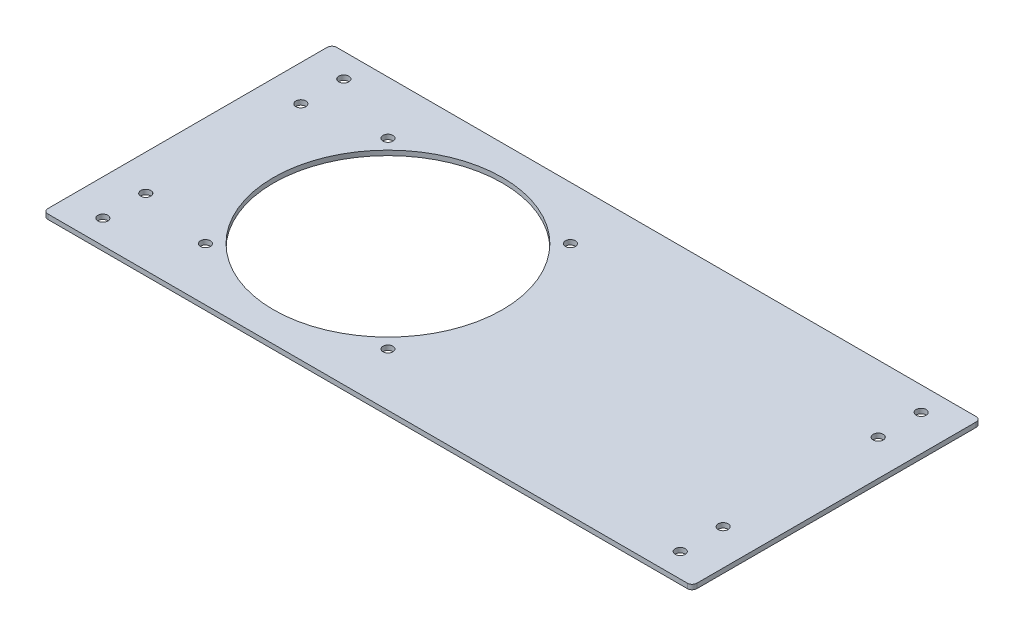
ISO-10303-21;
HEADER;
FILE_DESCRIPTION(('STEP AP214'),'2;1');
FILE_NAME('part.step','',(''),(''),'','','');
FILE_SCHEMA(('AUTOMOTIVE_DESIGN { 1 0 10303 214 1 1 1 1 }'));
ENDSEC;
DATA;
#1=APPLICATION_CONTEXT('core data for automotive mechanical design processes');
#2=APPLICATION_PROTOCOL_DEFINITION('international standard','automotive_design',2000,#1);
#3=PRODUCT_CONTEXT('',#1,'mechanical');
#4=PRODUCT('Part','Part','',(#3));
#5=PRODUCT_RELATED_PRODUCT_CATEGORY('part','',(#4));
#6=PRODUCT_DEFINITION_FORMATION('','',#4);
#7=PRODUCT_DEFINITION_CONTEXT('part definition',#1,'design');
#8=PRODUCT_DEFINITION('design','',#6,#7);
#9=PRODUCT_DEFINITION_SHAPE('','',#8);
#10=(LENGTH_UNIT() NAMED_UNIT(*) SI_UNIT(.MILLI.,.METRE.));
#11=(NAMED_UNIT(*) PLANE_ANGLE_UNIT() SI_UNIT($,.RADIAN.));
#12=(NAMED_UNIT(*) SI_UNIT($,.STERADIAN.) SOLID_ANGLE_UNIT());
#13=UNCERTAINTY_MEASURE_WITH_UNIT(LENGTH_MEASURE(1.E-05),#10,'distance_accuracy_value','');
#14=(GEOMETRIC_REPRESENTATION_CONTEXT(3) GLOBAL_UNCERTAINTY_ASSIGNED_CONTEXT((#13)) GLOBAL_UNIT_ASSIGNED_CONTEXT((#10,
#11,#12)) REPRESENTATION_CONTEXT('',''));
#15=CARTESIAN_POINT('',(0.,0.,0.));
#16=DIRECTION('',(0.,0.,1.));
#17=DIRECTION('',(1.,0.,0.));
#18=AXIS2_PLACEMENT_3D('',#15,#16,#17);
#19=CARTESIAN_POINT('',(136.,2.,60.5));
#20=DIRECTION('',(-1.,0.,0.));
#21=DIRECTION('',(0.,0.,1.));
#22=AXIS2_PLACEMENT_3D('',#19,#20,#21);
#23=PLANE('',#22);
#24=DIRECTION('',(0.,0.,-1.));
#25=VECTOR('',#24,1.);
#26=CARTESIAN_POINT('',(136.,0.,60.5));
#27=LINE('',#26,#25);
#28=CARTESIAN_POINT('',(136.,0.,58.5));
#29=VERTEX_POINT('',#28);
#30=CARTESIAN_POINT('',(136.,0.,-58.5));
#31=VERTEX_POINT('',#30);
#32=EDGE_CURVE('E130',#29,#31,#27,.T.);
#33=ORIENTED_EDGE('',*,*,#32,.T.);
#34=DIRECTION('',(0.,-1.,0.));
#35=VECTOR('',#34,1.);
#36=CARTESIAN_POINT('',(136.,2.,-58.5));
#37=LINE('',#36,#35);
#38=CARTESIAN_POINT('',(136.,2.,-58.5));
#39=VERTEX_POINT('',#38);
#40=EDGE_CURVE('E107',#31,#39,#37,.F.);
#41=ORIENTED_EDGE('',*,*,#40,.T.);
#42=DIRECTION('',(0.,0.,-1.));
#43=VECTOR('',#42,1.);
#44=CARTESIAN_POINT('',(136.,2.,60.5));
#45=LINE('',#44,#43);
#46=CARTESIAN_POINT('',(136.,2.,58.5));
#47=VERTEX_POINT('',#46);
#48=EDGE_CURVE('E140',#47,#39,#45,.T.);
#49=ORIENTED_EDGE('',*,*,#48,.F.);
#50=DIRECTION('',(0.,-1.,0.));
#51=VECTOR('',#50,1.);
#52=CARTESIAN_POINT('',(136.,2.,58.5));
#53=LINE('',#52,#51);
#54=EDGE_CURVE('E112',#47,#29,#53,.T.);
#55=ORIENTED_EDGE('',*,*,#54,.T.);
#56=EDGE_LOOP('',(#33,#41,#49,#55));
#57=FACE_BOUND('',#56,.T.);
#58=ADVANCED_FACE('F35',(#57),#23,.F.);
#59=CARTESIAN_POINT('',(-136.,2.,-60.5));
#60=DIRECTION('',(0.,0.,1.));
#61=DIRECTION('',(1.,0.,0.));
#62=AXIS2_PLACEMENT_3D('',#59,#60,#61);
#63=PLANE('',#62);
#64=DIRECTION('',(-1.,0.,0.));
#65=VECTOR('',#64,1.);
#66=CARTESIAN_POINT('',(-136.,2.,-60.5));
#67=LINE('',#66,#65);
#68=CARTESIAN_POINT('',(134.,2.,-60.5));
#69=VERTEX_POINT('',#68);
#70=CARTESIAN_POINT('',(-134.,2.,-60.5));
#71=VERTEX_POINT('',#70);
#72=EDGE_CURVE('E122',#69,#71,#67,.T.);
#73=ORIENTED_EDGE('',*,*,#72,.F.);
#74=DIRECTION('',(0.,-1.,0.));
#75=VECTOR('',#74,1.);
#76=CARTESIAN_POINT('',(134.,2.,-60.5));
#77=LINE('',#76,#75);
#78=CARTESIAN_POINT('',(134.,0.,-60.5));
#79=VERTEX_POINT('',#78);
#80=EDGE_CURVE('E106',#69,#79,#77,.T.);
#81=ORIENTED_EDGE('',*,*,#80,.T.);
#82=DIRECTION('',(-1.,0.,0.));
#83=VECTOR('',#82,1.);
#84=CARTESIAN_POINT('',(-136.,0.,-60.5));
#85=LINE('',#84,#83);
#86=CARTESIAN_POINT('',(-134.,0.,-60.5));
#87=VERTEX_POINT('',#86);
#88=EDGE_CURVE('E119',#79,#87,#85,.T.);
#89=ORIENTED_EDGE('',*,*,#88,.T.);
#90=DIRECTION('',(0.,-1.,0.));
#91=VECTOR('',#90,1.);
#92=CARTESIAN_POINT('',(-134.,2.,-60.5));
#93=LINE('',#92,#91);
#94=EDGE_CURVE('E124',#87,#71,#93,.F.);
#95=ORIENTED_EDGE('',*,*,#94,.T.);
#96=EDGE_LOOP('',(#73,#81,#89,#95));
#97=FACE_BOUND('',#96,.T.);
#98=ADVANCED_FACE('F118',(#97),#63,.F.);
#99=CARTESIAN_POINT('',(-136.,2.,60.5));
#100=DIRECTION('',(1.,0.,0.));
#101=DIRECTION('',(0.,0.,-1.));
#102=AXIS2_PLACEMENT_3D('',#99,#100,#101);
#103=PLANE('',#102);
#104=DIRECTION('',(0.,0.,1.));
#105=VECTOR('',#104,1.);
#106=CARTESIAN_POINT('',(-136.,2.,60.5));
#107=LINE('',#106,#105);
#108=CARTESIAN_POINT('',(-136.,2.,-58.5));
#109=VERTEX_POINT('',#108);
#110=CARTESIAN_POINT('',(-136.,2.,58.5));
#111=VERTEX_POINT('',#110);
#112=EDGE_CURVE('E163',#109,#111,#107,.T.);
#113=ORIENTED_EDGE('',*,*,#112,.F.);
#114=DIRECTION('',(0.,-1.,0.));
#115=VECTOR('',#114,1.);
#116=CARTESIAN_POINT('',(-136.,2.,-58.5));
#117=LINE('',#116,#115);
#118=CARTESIAN_POINT('',(-136.,0.,-58.5));
#119=VERTEX_POINT('',#118);
#120=EDGE_CURVE('E11',#109,#119,#117,.T.);
#121=ORIENTED_EDGE('',*,*,#120,.T.);
#122=DIRECTION('',(0.,0.,1.));
#123=VECTOR('',#122,1.);
#124=CARTESIAN_POINT('',(-136.,0.,60.5));
#125=LINE('',#124,#123);
#126=CARTESIAN_POINT('',(-136.,0.,58.5));
#127=VERTEX_POINT('',#126);
#128=EDGE_CURVE('E129',#119,#127,#125,.T.);
#129=ORIENTED_EDGE('',*,*,#128,.T.);
#130=DIRECTION('',(0.,-1.,0.));
#131=VECTOR('',#130,1.);
#132=CARTESIAN_POINT('',(-136.,2.,58.5));
#133=LINE('',#132,#131);
#134=EDGE_CURVE('E43',#127,#111,#133,.F.);
#135=ORIENTED_EDGE('',*,*,#134,.T.);
#136=EDGE_LOOP('',(#113,#121,#129,#135));
#137=FACE_BOUND('',#136,.T.);
#138=ADVANCED_FACE('F162',(#137),#103,.F.);
#139=CARTESIAN_POINT('',(-136.,2.,60.5));
#140=DIRECTION('',(0.,0.,-1.));
#141=DIRECTION('',(-1.,0.,0.));
#142=AXIS2_PLACEMENT_3D('',#139,#140,#141);
#143=PLANE('',#142);
#144=DIRECTION('',(1.,0.,0.));
#145=VECTOR('',#144,1.);
#146=CARTESIAN_POINT('',(-136.,0.,60.5));
#147=LINE('',#146,#145);
#148=CARTESIAN_POINT('',(-134.,0.,60.5));
#149=VERTEX_POINT('',#148);
#150=CARTESIAN_POINT('',(134.,0.,60.5));
#151=VERTEX_POINT('',#150);
#152=EDGE_CURVE('E133',#149,#151,#147,.T.);
#153=ORIENTED_EDGE('',*,*,#152,.T.);
#154=DIRECTION('',(0.,-1.,0.));
#155=VECTOR('',#154,1.);
#156=CARTESIAN_POINT('',(134.,2.,60.5));
#157=LINE('',#156,#155);
#158=CARTESIAN_POINT('',(134.,2.,60.5));
#159=VERTEX_POINT('',#158);
#160=EDGE_CURVE('E50',#151,#159,#157,.F.);
#161=ORIENTED_EDGE('',*,*,#160,.T.);
#162=DIRECTION('',(1.,0.,0.));
#163=VECTOR('',#162,1.);
#164=CARTESIAN_POINT('',(-136.,2.,60.5));
#165=LINE('',#164,#163);
#166=CARTESIAN_POINT('',(-134.,2.,60.5));
#167=VERTEX_POINT('',#166);
#168=EDGE_CURVE('E141',#167,#159,#165,.T.);
#169=ORIENTED_EDGE('',*,*,#168,.F.);
#170=DIRECTION('',(0.,-1.,0.));
#171=VECTOR('',#170,1.);
#172=CARTESIAN_POINT('',(-134.,2.,60.5));
#173=LINE('',#172,#171);
#174=EDGE_CURVE('E156',#167,#149,#173,.T.);
#175=ORIENTED_EDGE('',*,*,#174,.T.);
#176=EDGE_LOOP('',(#153,#161,#169,#175));
#177=FACE_BOUND('',#176,.T.);
#178=ADVANCED_FACE('F172',(#177),#143,.F.);
#179=CARTESIAN_POINT('',(0.,2.,0.));
#180=DIRECTION('',(0.,-1.,0.));
#181=DIRECTION('',(0.,0.,-1.));
#182=AXIS2_PLACEMENT_3D('',#179,#180,#181);
#183=PLANE('',#182);
#184=CARTESIAN_POINT('',(-13.75,2.,38.25));
#185=DIRECTION('',(0.,-1.,0.));
#186=DIRECTION('',(0.,0.,-1.));
#187=AXIS2_PLACEMENT_3D('',#184,#185,#186);
#188=CIRCLE('',#187,2.06);
#189=CARTESIAN_POINT('',(-13.75,2.,36.19));
#190=VERTEX_POINT('',#189);
#191=EDGE_CURVE('E233',#190,#190,#188,.T.);
#192=ORIENTED_EDGE('',*,*,#191,.T.);
#193=EDGE_LOOP('',(#192));
#194=FACE_BOUND('',#193,.T.);
#195=CARTESIAN_POINT('',(-90.25,2.,38.25));
#196=DIRECTION('',(0.,-1.,0.));
#197=DIRECTION('',(0.,0.,-1.));
#198=AXIS2_PLACEMENT_3D('',#195,#196,#197);
#199=CIRCLE('',#198,2.1);
#200=CARTESIAN_POINT('',(-90.25,2.,36.15));
#201=VERTEX_POINT('',#200);
#202=EDGE_CURVE('E239',#201,#201,#199,.T.);
#203=ORIENTED_EDGE('',*,*,#202,.T.);
#204=EDGE_LOOP('',(#203));
#205=FACE_BOUND('',#204,.T.);
#206=CARTESIAN_POINT('',(-52.,2.,0.));
#207=DIRECTION('',(0.,-1.,0.));
#208=DIRECTION('',(0.,0.,-1.));
#209=AXIS2_PLACEMENT_3D('',#206,#207,#208);
#210=CIRCLE('',#209,48.);
#211=CARTESIAN_POINT('',(-52.,2.,-48.));
#212=VERTEX_POINT('',#211);
#213=EDGE_CURVE('E251',#212,#212,#210,.T.);
#214=ORIENTED_EDGE('',*,*,#213,.T.);
#215=EDGE_LOOP('',(#214));
#216=FACE_BOUND('',#215,.T.);
#217=CARTESIAN_POINT('',(-90.25,2.,-38.25));
#218=DIRECTION('',(0.,-1.,0.));
#219=DIRECTION('',(0.,0.,-1.));
#220=AXIS2_PLACEMENT_3D('',#217,#218,#219);
#221=CIRCLE('',#220,2.1);
#222=CARTESIAN_POINT('',(-90.25,2.,-40.35));
#223=VERTEX_POINT('',#222);
#224=EDGE_CURVE('E240',#223,#223,#221,.T.);
#225=ORIENTED_EDGE('',*,*,#224,.T.);
#226=EDGE_LOOP('',(#225));
#227=FACE_BOUND('',#226,.T.);
#228=CARTESIAN_POINT('',(-13.75,2.,-38.25));
#229=DIRECTION('',(0.,-1.,0.));
#230=DIRECTION('',(0.,0.,-1.));
#231=AXIS2_PLACEMENT_3D('',#228,#229,#230);
#232=CIRCLE('',#231,2.1);
#233=CARTESIAN_POINT('',(-13.75,2.,-40.35));
#234=VERTEX_POINT('',#233);
#235=EDGE_CURVE('E216',#234,#234,#232,.T.);
#236=ORIENTED_EDGE('',*,*,#235,.T.);
#237=EDGE_LOOP('',(#236));
#238=FACE_BOUND('',#237,.T.);
#239=CARTESIAN_POINT('',(121.,2.,-32.5));
#240=DIRECTION('',(0.,1.,0.));
#241=DIRECTION('',(0.,0.,1.));
#242=AXIS2_PLACEMENT_3D('',#239,#240,#241);
#243=CIRCLE('',#242,2.10000000000002);
#244=CARTESIAN_POINT('',(121.,2.,-30.4));
#245=VERTEX_POINT('',#244);
#246=EDGE_CURVE('E207',#245,#245,#243,.T.);
#247=ORIENTED_EDGE('',*,*,#246,.F.);
#248=EDGE_LOOP('',(#247));
#249=FACE_BOUND('',#248,.T.);
#250=CARTESIAN_POINT('',(121.,2.,32.5));
#251=DIRECTION('',(0.,1.,0.));
#252=DIRECTION('',(0.,0.,-1.));
#253=AXIS2_PLACEMENT_3D('',#250,#251,#252);
#254=CIRCLE('',#253,2.10000000000002);
#255=CARTESIAN_POINT('',(121.,2.,30.4));
#256=VERTEX_POINT('',#255);
#257=EDGE_CURVE('E201',#256,#256,#254,.T.);
#258=ORIENTED_EDGE('',*,*,#257,.F.);
#259=EDGE_LOOP('',(#258));
#260=FACE_BOUND('',#259,.T.);
#261=CARTESIAN_POINT('',(121.,2.,50.5));
#262=DIRECTION('',(0.,1.,0.));
#263=DIRECTION('',(0.,0.,-1.));
#264=AXIS2_PLACEMENT_3D('',#261,#262,#263);
#265=CIRCLE('',#264,2.10000000000002);
#266=CARTESIAN_POINT('',(121.,2.,48.4));
#267=VERTEX_POINT('',#266);
#268=EDGE_CURVE('E195',#267,#267,#265,.T.);
#269=ORIENTED_EDGE('',*,*,#268,.F.);
#270=EDGE_LOOP('',(#269));
#271=FACE_BOUND('',#270,.T.);
#272=CARTESIAN_POINT('',(-121.,2.,50.5));
#273=DIRECTION('',(0.,1.,0.));
#274=DIRECTION('',(0.,0.,1.));
#275=AXIS2_PLACEMENT_3D('',#272,#273,#274);
#276=CIRCLE('',#275,2.1);
#277=CARTESIAN_POINT('',(-121.,2.,52.6));
#278=VERTEX_POINT('',#277);
#279=EDGE_CURVE('E188',#278,#278,#276,.T.);
#280=ORIENTED_EDGE('',*,*,#279,.F.);
#281=EDGE_LOOP('',(#280));
#282=FACE_BOUND('',#281,.T.);
#283=CARTESIAN_POINT('',(-121.,2.,32.5));
#284=DIRECTION('',(0.,1.,0.));
#285=DIRECTION('',(0.,0.,1.));
#286=AXIS2_PLACEMENT_3D('',#283,#284,#285);
#287=CIRCLE('',#286,2.1);
#288=CARTESIAN_POINT('',(-121.,2.,34.6));
#289=VERTEX_POINT('',#288);
#290=EDGE_CURVE('E225',#289,#289,#287,.T.);
#291=ORIENTED_EDGE('',*,*,#290,.F.);
#292=EDGE_LOOP('',(#291));
#293=FACE_BOUND('',#292,.T.);
#294=CARTESIAN_POINT('',(-121.,2.,-32.5));
#295=DIRECTION('',(0.,1.,0.));
#296=DIRECTION('',(0.,0.,-1.));
#297=AXIS2_PLACEMENT_3D('',#294,#295,#296);
#298=CIRCLE('',#297,2.1);
#299=CARTESIAN_POINT('',(-121.,2.,-34.6));
#300=VERTEX_POINT('',#299);
#301=EDGE_CURVE('E219',#300,#300,#298,.T.);
#302=ORIENTED_EDGE('',*,*,#301,.F.);
#303=EDGE_LOOP('',(#302));
#304=FACE_BOUND('',#303,.T.);
#305=CARTESIAN_POINT('',(-121.,2.,-50.5));
#306=DIRECTION('',(0.,1.,0.));
#307=DIRECTION('',(0.,0.,-1.));
#308=AXIS2_PLACEMENT_3D('',#305,#306,#307);
#309=CIRCLE('',#308,2.1);
#310=CARTESIAN_POINT('',(-121.,2.,-52.6));
#311=VERTEX_POINT('',#310);
#312=EDGE_CURVE('E212',#311,#311,#309,.T.);
#313=ORIENTED_EDGE('',*,*,#312,.F.);
#314=EDGE_LOOP('',(#313));
#315=FACE_BOUND('',#314,.T.);
#316=CARTESIAN_POINT('',(121.,2.,-50.5));
#317=DIRECTION('',(0.,1.,0.));
#318=DIRECTION('',(0.,0.,1.));
#319=AXIS2_PLACEMENT_3D('',#316,#317,#318);
#320=CIRCLE('',#319,2.10000000000002);
#321=CARTESIAN_POINT('',(121.,2.,-48.4));
#322=VERTEX_POINT('',#321);
#323=EDGE_CURVE('E182',#322,#322,#320,.T.);
#324=ORIENTED_EDGE('',*,*,#323,.F.);
#325=EDGE_LOOP('',(#324));
#326=FACE_BOUND('',#325,.T.);
#327=ORIENTED_EDGE('',*,*,#48,.T.);
#328=CARTESIAN_POINT('',(134.,2.,-58.5));
#329=DIRECTION('',(0.,-1.,0.));
#330=DIRECTION('',(0.,0.,-1.));
#331=AXIS2_PLACEMENT_3D('',#328,#329,#330);
#332=CIRCLE('',#331,2.);
#333=EDGE_CURVE('E154',#39,#69,#332,.F.);
#334=ORIENTED_EDGE('',*,*,#333,.T.);
#335=ORIENTED_EDGE('',*,*,#72,.T.);
#336=CARTESIAN_POINT('',(-134.,2.,-58.5));
#337=DIRECTION('',(0.,-1.,0.));
#338=DIRECTION('',(0.,0.,-1.));
#339=AXIS2_PLACEMENT_3D('',#336,#337,#338);
#340=CIRCLE('',#339,2.);
#341=EDGE_CURVE('E150',#71,#109,#340,.F.);
#342=ORIENTED_EDGE('',*,*,#341,.T.);
#343=ORIENTED_EDGE('',*,*,#112,.T.);
#344=CARTESIAN_POINT('',(-134.,2.,58.5));
#345=DIRECTION('',(0.,-1.,0.));
#346=DIRECTION('',(0.,0.,-1.));
#347=AXIS2_PLACEMENT_3D('',#344,#345,#346);
#348=CIRCLE('',#347,2.);
#349=EDGE_CURVE('E57',#111,#167,#348,.F.);
#350=ORIENTED_EDGE('',*,*,#349,.T.);
#351=ORIENTED_EDGE('',*,*,#168,.T.);
#352=CARTESIAN_POINT('',(134.,2.,58.5));
#353=DIRECTION('',(0.,-1.,0.));
#354=DIRECTION('',(0.,0.,-1.));
#355=AXIS2_PLACEMENT_3D('',#352,#353,#354);
#356=CIRCLE('',#355,2.);
#357=EDGE_CURVE('E152',#159,#47,#356,.F.);
#358=ORIENTED_EDGE('',*,*,#357,.T.);
#359=EDGE_LOOP('',(#327,#334,#335,#342,#343,#350,#351,#358));
#360=FACE_BOUND('',#359,.T.);
#361=ADVANCED_FACE('F167',(#194,#205,#216,#227,#238,#249,#260,#271,#282,#293,#304,#315,#326,
#360),#183,.F.);
#362=CARTESIAN_POINT('',(0.,0.,0.));
#363=DIRECTION('',(0.,-1.,0.));
#364=DIRECTION('',(0.,0.,-1.));
#365=AXIS2_PLACEMENT_3D('',#362,#363,#364);
#366=PLANE('',#365);
#367=CARTESIAN_POINT('',(-13.75,0.,38.25));
#368=DIRECTION('',(0.,-1.,0.));
#369=DIRECTION('',(0.,0.,-1.));
#370=AXIS2_PLACEMENT_3D('',#367,#368,#369);
#371=CIRCLE('',#370,2.06);
#372=CARTESIAN_POINT('',(-13.75,0.,36.19));
#373=VERTEX_POINT('',#372);
#374=EDGE_CURVE('E243',#373,#373,#371,.T.);
#375=ORIENTED_EDGE('',*,*,#374,.F.);
#376=EDGE_LOOP('',(#375));
#377=FACE_BOUND('',#376,.T.);
#378=CARTESIAN_POINT('',(-90.25,0.,38.25));
#379=DIRECTION('',(0.,-1.,0.));
#380=DIRECTION('',(0.,0.,-1.));
#381=AXIS2_PLACEMENT_3D('',#378,#379,#380);
#382=CIRCLE('',#381,2.1);
#383=CARTESIAN_POINT('',(-90.25,0.,36.15));
#384=VERTEX_POINT('',#383);
#385=EDGE_CURVE('E236',#384,#384,#382,.T.);
#386=ORIENTED_EDGE('',*,*,#385,.F.);
#387=EDGE_LOOP('',(#386));
#388=FACE_BOUND('',#387,.T.);
#389=CARTESIAN_POINT('',(-52.,0.,0.));
#390=DIRECTION('',(0.,-1.,0.));
#391=DIRECTION('',(0.,0.,-1.));
#392=AXIS2_PLACEMENT_3D('',#389,#390,#391);
#393=CIRCLE('',#392,48.);
#394=CARTESIAN_POINT('',(-52.,0.,-48.));
#395=VERTEX_POINT('',#394);
#396=EDGE_CURVE('E254',#395,#395,#393,.T.);
#397=ORIENTED_EDGE('',*,*,#396,.F.);
#398=EDGE_LOOP('',(#397));
#399=FACE_BOUND('',#398,.T.);
#400=CARTESIAN_POINT('',(-90.25,0.,-38.25));
#401=DIRECTION('',(0.,-1.,0.));
#402=DIRECTION('',(0.,0.,-1.));
#403=AXIS2_PLACEMENT_3D('',#400,#401,#402);
#404=CIRCLE('',#403,2.1);
#405=CARTESIAN_POINT('',(-90.25,0.,-40.35));
#406=VERTEX_POINT('',#405);
#407=EDGE_CURVE('E248',#406,#406,#404,.T.);
#408=ORIENTED_EDGE('',*,*,#407,.F.);
#409=EDGE_LOOP('',(#408));
#410=FACE_BOUND('',#409,.T.);
#411=CARTESIAN_POINT('',(-13.75,0.,-38.25));
#412=DIRECTION('',(0.,-1.,0.));
#413=DIRECTION('',(0.,0.,-1.));
#414=AXIS2_PLACEMENT_3D('',#411,#412,#413);
#415=CIRCLE('',#414,2.1);
#416=CARTESIAN_POINT('',(-13.75,0.,-40.35));
#417=VERTEX_POINT('',#416);
#418=EDGE_CURVE('E230',#417,#417,#415,.T.);
#419=ORIENTED_EDGE('',*,*,#418,.F.);
#420=EDGE_LOOP('',(#419));
#421=FACE_BOUND('',#420,.T.);
#422=CARTESIAN_POINT('',(121.,0.,-32.5));
#423=DIRECTION('',(0.,1.,0.));
#424=DIRECTION('',(0.,0.,1.));
#425=AXIS2_PLACEMENT_3D('',#422,#423,#424);
#426=CIRCLE('',#425,2.10000000000002);
#427=CARTESIAN_POINT('',(121.,0.,-30.4));
#428=VERTEX_POINT('',#427);
#429=EDGE_CURVE('E185',#428,#428,#426,.T.);
#430=ORIENTED_EDGE('',*,*,#429,.T.);
#431=EDGE_LOOP('',(#430));
#432=FACE_BOUND('',#431,.T.);
#433=CARTESIAN_POINT('',(121.,0.,32.5));
#434=DIRECTION('',(0.,1.,0.));
#435=DIRECTION('',(0.,0.,-1.));
#436=AXIS2_PLACEMENT_3D('',#433,#434,#435);
#437=CIRCLE('',#436,2.10000000000002);
#438=CARTESIAN_POINT('',(121.,0.,30.4));
#439=VERTEX_POINT('',#438);
#440=EDGE_CURVE('E204',#439,#439,#437,.T.);
#441=ORIENTED_EDGE('',*,*,#440,.T.);
#442=EDGE_LOOP('',(#441));
#443=FACE_BOUND('',#442,.T.);
#444=CARTESIAN_POINT('',(121.,0.,50.5));
#445=DIRECTION('',(0.,1.,0.));
#446=DIRECTION('',(0.,0.,-1.));
#447=AXIS2_PLACEMENT_3D('',#444,#445,#446);
#448=CIRCLE('',#447,2.10000000000002);
#449=CARTESIAN_POINT('',(121.,0.,48.4));
#450=VERTEX_POINT('',#449);
#451=EDGE_CURVE('E198',#450,#450,#448,.T.);
#452=ORIENTED_EDGE('',*,*,#451,.T.);
#453=EDGE_LOOP('',(#452));
#454=FACE_BOUND('',#453,.T.);
#455=CARTESIAN_POINT('',(-121.,0.,50.5));
#456=DIRECTION('',(0.,1.,0.));
#457=DIRECTION('',(0.,0.,1.));
#458=AXIS2_PLACEMENT_3D('',#455,#456,#457);
#459=CIRCLE('',#458,2.1);
#460=CARTESIAN_POINT('',(-121.,0.,52.6));
#461=VERTEX_POINT('',#460);
#462=EDGE_CURVE('E191',#461,#461,#459,.T.);
#463=ORIENTED_EDGE('',*,*,#462,.T.);
#464=EDGE_LOOP('',(#463));
#465=FACE_BOUND('',#464,.T.);
#466=CARTESIAN_POINT('',(-121.,0.,32.5));
#467=DIRECTION('',(0.,1.,0.));
#468=DIRECTION('',(0.,0.,1.));
#469=AXIS2_PLACEMENT_3D('',#466,#467,#468);
#470=CIRCLE('',#469,2.1);
#471=CARTESIAN_POINT('',(-121.,0.,34.6));
#472=VERTEX_POINT('',#471);
#473=EDGE_CURVE('E192',#472,#472,#470,.T.);
#474=ORIENTED_EDGE('',*,*,#473,.T.);
#475=EDGE_LOOP('',(#474));
#476=FACE_BOUND('',#475,.T.);
#477=CARTESIAN_POINT('',(-121.,0.,-32.5));
#478=DIRECTION('',(0.,1.,0.));
#479=DIRECTION('',(0.,0.,-1.));
#480=AXIS2_PLACEMENT_3D('',#477,#478,#479);
#481=CIRCLE('',#480,2.1);
#482=CARTESIAN_POINT('',(-121.,0.,-34.6));
#483=VERTEX_POINT('',#482);
#484=EDGE_CURVE('E222',#483,#483,#481,.T.);
#485=ORIENTED_EDGE('',*,*,#484,.T.);
#486=EDGE_LOOP('',(#485));
#487=FACE_BOUND('',#486,.T.);
#488=CARTESIAN_POINT('',(-121.,0.,-50.5));
#489=DIRECTION('',(0.,1.,0.));
#490=DIRECTION('',(0.,0.,-1.));
#491=AXIS2_PLACEMENT_3D('',#488,#489,#490);
#492=CIRCLE('',#491,2.1);
#493=CARTESIAN_POINT('',(-121.,0.,-52.6));
#494=VERTEX_POINT('',#493);
#495=EDGE_CURVE('E215',#494,#494,#492,.T.);
#496=ORIENTED_EDGE('',*,*,#495,.T.);
#497=EDGE_LOOP('',(#496));
#498=FACE_BOUND('',#497,.T.);
#499=CARTESIAN_POINT('',(121.,0.,-50.5));
#500=DIRECTION('',(0.,1.,0.));
#501=DIRECTION('',(0.,0.,1.));
#502=AXIS2_PLACEMENT_3D('',#499,#500,#501);
#503=CIRCLE('',#502,2.10000000000002);
#504=CARTESIAN_POINT('',(121.,0.,-48.4));
#505=VERTEX_POINT('',#504);
#506=EDGE_CURVE('E135',#505,#505,#503,.T.);
#507=ORIENTED_EDGE('',*,*,#506,.T.);
#508=EDGE_LOOP('',(#507));
#509=FACE_BOUND('',#508,.T.);
#510=ORIENTED_EDGE('',*,*,#88,.F.);
#511=CARTESIAN_POINT('',(134.,0.,-58.5));
#512=DIRECTION('',(0.,-1.,0.));
#513=DIRECTION('',(0.,0.,-1.));
#514=AXIS2_PLACEMENT_3D('',#511,#512,#513);
#515=CIRCLE('',#514,2.);
#516=EDGE_CURVE('E102',#79,#31,#515,.T.);
#517=ORIENTED_EDGE('',*,*,#516,.T.);
#518=ORIENTED_EDGE('',*,*,#32,.F.);
#519=CARTESIAN_POINT('',(134.,0.,58.5));
#520=DIRECTION('',(0.,-1.,0.));
#521=DIRECTION('',(0.,0.,-1.));
#522=AXIS2_PLACEMENT_3D('',#519,#520,#521);
#523=CIRCLE('',#522,2.);
#524=EDGE_CURVE('E113',#29,#151,#523,.T.);
#525=ORIENTED_EDGE('',*,*,#524,.T.);
#526=ORIENTED_EDGE('',*,*,#152,.F.);
#527=CARTESIAN_POINT('',(-134.,0.,58.5));
#528=DIRECTION('',(0.,-1.,0.));
#529=DIRECTION('',(0.,0.,-1.));
#530=AXIS2_PLACEMENT_3D('',#527,#528,#529);
#531=CIRCLE('',#530,2.);
#532=EDGE_CURVE('E123',#149,#127,#531,.T.);
#533=ORIENTED_EDGE('',*,*,#532,.T.);
#534=ORIENTED_EDGE('',*,*,#128,.F.);
#535=CARTESIAN_POINT('',(-134.,0.,-58.5));
#536=DIRECTION('',(0.,-1.,0.));
#537=DIRECTION('',(0.,0.,-1.));
#538=AXIS2_PLACEMENT_3D('',#535,#536,#537);
#539=CIRCLE('',#538,2.);
#540=EDGE_CURVE('E128',#119,#87,#539,.T.);
#541=ORIENTED_EDGE('',*,*,#540,.T.);
#542=EDGE_LOOP('',(#510,#517,#518,#525,#526,#533,#534,#541));
#543=FACE_BOUND('',#542,.T.);
#544=ADVANCED_FACE('F126',(#377,#388,#399,#410,#421,#432,#443,#454,#465,#476,#487,#498,#509,
#543),#366,.T.);
#545=CARTESIAN_POINT('',(121.,0.,-50.5));
#546=DIRECTION('',(0.,1.,0.));
#547=DIRECTION('',(0.,0.,1.));
#548=AXIS2_PLACEMENT_3D('',#545,#546,#547);
#549=CYLINDRICAL_SURFACE('',#548,2.10000000000002);
#550=ORIENTED_EDGE('',*,*,#506,.F.);
#551=EDGE_LOOP('',(#550));
#552=FACE_BOUND('',#551,.T.);
#553=ORIENTED_EDGE('',*,*,#323,.T.);
#554=EDGE_LOOP('',(#553));
#555=FACE_BOUND('',#554,.T.);
#556=ADVANCED_FACE('F272',(#552,#555),#549,.F.);
#557=CARTESIAN_POINT('',(-121.,0.,-50.5));
#558=DIRECTION('',(0.,1.,0.));
#559=DIRECTION('',(0.,0.,1.));
#560=AXIS2_PLACEMENT_3D('',#557,#558,#559);
#561=CYLINDRICAL_SURFACE('',#560,2.1);
#562=ORIENTED_EDGE('',*,*,#495,.F.);
#563=EDGE_LOOP('',(#562));
#564=FACE_BOUND('',#563,.T.);
#565=ORIENTED_EDGE('',*,*,#312,.T.);
#566=EDGE_LOOP('',(#565));
#567=FACE_BOUND('',#566,.T.);
#568=ADVANCED_FACE('F297',(#564,#567),#561,.F.);
#569=CARTESIAN_POINT('',(-121.,0.,-32.5));
#570=DIRECTION('',(0.,1.,0.));
#571=DIRECTION('',(0.,0.,1.));
#572=AXIS2_PLACEMENT_3D('',#569,#570,#571);
#573=CYLINDRICAL_SURFACE('',#572,2.1);
#574=ORIENTED_EDGE('',*,*,#484,.F.);
#575=EDGE_LOOP('',(#574));
#576=FACE_BOUND('',#575,.T.);
#577=ORIENTED_EDGE('',*,*,#301,.T.);
#578=EDGE_LOOP('',(#577));
#579=FACE_BOUND('',#578,.T.);
#580=ADVANCED_FACE('F347',(#576,#579),#573,.F.);
#581=CARTESIAN_POINT('',(-121.,0.,32.5));
#582=DIRECTION('',(0.,1.,0.));
#583=DIRECTION('',(0.,0.,1.));
#584=AXIS2_PLACEMENT_3D('',#581,#582,#583);
#585=CYLINDRICAL_SURFACE('',#584,2.1);
#586=ORIENTED_EDGE('',*,*,#473,.F.);
#587=EDGE_LOOP('',(#586));
#588=FACE_BOUND('',#587,.T.);
#589=ORIENTED_EDGE('',*,*,#290,.T.);
#590=EDGE_LOOP('',(#589));
#591=FACE_BOUND('',#590,.T.);
#592=ADVANCED_FACE('F343',(#588,#591),#585,.F.);
#593=CARTESIAN_POINT('',(-121.,0.,50.5));
#594=DIRECTION('',(0.,1.,0.));
#595=DIRECTION('',(0.,0.,1.));
#596=AXIS2_PLACEMENT_3D('',#593,#594,#595);
#597=CYLINDRICAL_SURFACE('',#596,2.1);
#598=ORIENTED_EDGE('',*,*,#462,.F.);
#599=EDGE_LOOP('',(#598));
#600=FACE_BOUND('',#599,.T.);
#601=ORIENTED_EDGE('',*,*,#279,.T.);
#602=EDGE_LOOP('',(#601));
#603=FACE_BOUND('',#602,.T.);
#604=ADVANCED_FACE('F346',(#600,#603),#597,.F.);
#605=CARTESIAN_POINT('',(121.,0.,50.5));
#606=DIRECTION('',(0.,1.,0.));
#607=DIRECTION('',(0.,0.,1.));
#608=AXIS2_PLACEMENT_3D('',#605,#606,#607);
#609=CYLINDRICAL_SURFACE('',#608,2.10000000000002);
#610=ORIENTED_EDGE('',*,*,#451,.F.);
#611=EDGE_LOOP('',(#610));
#612=FACE_BOUND('',#611,.T.);
#613=ORIENTED_EDGE('',*,*,#268,.T.);
#614=EDGE_LOOP('',(#613));
#615=FACE_BOUND('',#614,.T.);
#616=ADVANCED_FACE('F361',(#612,#615),#609,.F.);
#617=CARTESIAN_POINT('',(121.,0.,32.5));
#618=DIRECTION('',(0.,1.,0.));
#619=DIRECTION('',(0.,0.,1.));
#620=AXIS2_PLACEMENT_3D('',#617,#618,#619);
#621=CYLINDRICAL_SURFACE('',#620,2.10000000000002);
#622=ORIENTED_EDGE('',*,*,#440,.F.);
#623=EDGE_LOOP('',(#622));
#624=FACE_BOUND('',#623,.T.);
#625=ORIENTED_EDGE('',*,*,#257,.T.);
#626=EDGE_LOOP('',(#625));
#627=FACE_BOUND('',#626,.T.);
#628=ADVANCED_FACE('F357',(#624,#627),#621,.F.);
#629=CARTESIAN_POINT('',(121.,0.,-32.5));
#630=DIRECTION('',(0.,1.,0.));
#631=DIRECTION('',(0.,0.,1.));
#632=AXIS2_PLACEMENT_3D('',#629,#630,#631);
#633=CYLINDRICAL_SURFACE('',#632,2.10000000000002);
#634=ORIENTED_EDGE('',*,*,#429,.F.);
#635=EDGE_LOOP('',(#634));
#636=FACE_BOUND('',#635,.T.);
#637=ORIENTED_EDGE('',*,*,#246,.T.);
#638=EDGE_LOOP('',(#637));
#639=FACE_BOUND('',#638,.T.);
#640=ADVANCED_FACE('F319',(#636,#639),#633,.F.);
#641=CARTESIAN_POINT('',(134.,2.,-58.5));
#642=DIRECTION('',(0.,-1.,0.));
#643=DIRECTION('',(0.,0.,-1.));
#644=AXIS2_PLACEMENT_3D('',#641,#642,#643);
#645=CYLINDRICAL_SURFACE('',#644,2.);
#646=ORIENTED_EDGE('',*,*,#333,.F.);
#647=ORIENTED_EDGE('',*,*,#40,.F.);
#648=ORIENTED_EDGE('',*,*,#516,.F.);
#649=ORIENTED_EDGE('',*,*,#80,.F.);
#650=EDGE_LOOP('',(#646,#647,#648,#649));
#651=FACE_BOUND('',#650,.T.);
#652=ADVANCED_FACE('F105',(#651),#645,.T.);
#653=CARTESIAN_POINT('',(134.,2.,58.5));
#654=DIRECTION('',(0.,-1.,0.));
#655=DIRECTION('',(0.,0.,-1.));
#656=AXIS2_PLACEMENT_3D('',#653,#654,#655);
#657=CYLINDRICAL_SURFACE('',#656,2.);
#658=ORIENTED_EDGE('',*,*,#357,.F.);
#659=ORIENTED_EDGE('',*,*,#160,.F.);
#660=ORIENTED_EDGE('',*,*,#524,.F.);
#661=ORIENTED_EDGE('',*,*,#54,.F.);
#662=EDGE_LOOP('',(#658,#659,#660,#661));
#663=FACE_BOUND('',#662,.T.);
#664=ADVANCED_FACE('F176',(#663),#657,.T.);
#665=CARTESIAN_POINT('',(-134.,2.,-58.5));
#666=DIRECTION('',(0.,-1.,0.));
#667=DIRECTION('',(0.,0.,-1.));
#668=AXIS2_PLACEMENT_3D('',#665,#666,#667);
#669=CYLINDRICAL_SURFACE('',#668,2.);
#670=ORIENTED_EDGE('',*,*,#341,.F.);
#671=ORIENTED_EDGE('',*,*,#94,.F.);
#672=ORIENTED_EDGE('',*,*,#540,.F.);
#673=ORIENTED_EDGE('',*,*,#120,.F.);
#674=EDGE_LOOP('',(#670,#671,#672,#673));
#675=FACE_BOUND('',#674,.T.);
#676=ADVANCED_FACE('F321',(#675),#669,.T.);
#677=CARTESIAN_POINT('',(-134.,2.,58.5));
#678=DIRECTION('',(0.,-1.,0.));
#679=DIRECTION('',(0.,0.,-1.));
#680=AXIS2_PLACEMENT_3D('',#677,#678,#679);
#681=CYLINDRICAL_SURFACE('',#680,2.);
#682=ORIENTED_EDGE('',*,*,#349,.F.);
#683=ORIENTED_EDGE('',*,*,#134,.F.);
#684=ORIENTED_EDGE('',*,*,#532,.F.);
#685=ORIENTED_EDGE('',*,*,#174,.F.);
#686=EDGE_LOOP('',(#682,#683,#684,#685));
#687=FACE_BOUND('',#686,.T.);
#688=ADVANCED_FACE('F37',(#687),#681,.T.);
#689=CARTESIAN_POINT('',(-13.75,2.,-38.25));
#690=DIRECTION('',(0.,-1.,0.));
#691=DIRECTION('',(0.,0.,-1.));
#692=AXIS2_PLACEMENT_3D('',#689,#690,#691);
#693=CYLINDRICAL_SURFACE('',#692,2.1);
#694=ORIENTED_EDGE('',*,*,#235,.F.);
#695=EDGE_LOOP('',(#694));
#696=FACE_BOUND('',#695,.T.);
#697=ORIENTED_EDGE('',*,*,#418,.T.);
#698=EDGE_LOOP('',(#697));
#699=FACE_BOUND('',#698,.T.);
#700=ADVANCED_FACE('F327',(#696,#699),#693,.F.);
#701=CARTESIAN_POINT('',(-90.25,2.,-38.25));
#702=DIRECTION('',(0.,-1.,0.));
#703=DIRECTION('',(0.,0.,-1.));
#704=AXIS2_PLACEMENT_3D('',#701,#702,#703);
#705=CYLINDRICAL_SURFACE('',#704,2.1);
#706=ORIENTED_EDGE('',*,*,#224,.F.);
#707=EDGE_LOOP('',(#706));
#708=FACE_BOUND('',#707,.T.);
#709=ORIENTED_EDGE('',*,*,#407,.T.);
#710=EDGE_LOOP('',(#709));
#711=FACE_BOUND('',#710,.T.);
#712=ADVANCED_FACE('F266',(#708,#711),#705,.F.);
#713=CARTESIAN_POINT('',(-52.,2.,0.));
#714=DIRECTION('',(0.,-1.,0.));
#715=DIRECTION('',(0.,0.,-1.));
#716=AXIS2_PLACEMENT_3D('',#713,#714,#715);
#717=CYLINDRICAL_SURFACE('',#716,48.);
#718=ORIENTED_EDGE('',*,*,#213,.F.);
#719=EDGE_LOOP('',(#718));
#720=FACE_BOUND('',#719,.T.);
#721=ORIENTED_EDGE('',*,*,#396,.T.);
#722=EDGE_LOOP('',(#721));
#723=FACE_BOUND('',#722,.T.);
#724=ADVANCED_FACE('F262',(#720,#723),#717,.F.);
#725=CARTESIAN_POINT('',(-90.25,2.,38.25));
#726=DIRECTION('',(0.,-1.,0.));
#727=DIRECTION('',(0.,0.,-1.));
#728=AXIS2_PLACEMENT_3D('',#725,#726,#727);
#729=CYLINDRICAL_SURFACE('',#728,2.1);
#730=ORIENTED_EDGE('',*,*,#202,.F.);
#731=EDGE_LOOP('',(#730));
#732=FACE_BOUND('',#731,.T.);
#733=ORIENTED_EDGE('',*,*,#385,.T.);
#734=EDGE_LOOP('',(#733));
#735=FACE_BOUND('',#734,.T.);
#736=ADVANCED_FACE('F265',(#732,#735),#729,.F.);
#737=CARTESIAN_POINT('',(-13.75,2.,38.25));
#738=DIRECTION('',(0.,-1.,0.));
#739=DIRECTION('',(0.,0.,-1.));
#740=AXIS2_PLACEMENT_3D('',#737,#738,#739);
#741=CYLINDRICAL_SURFACE('',#740,2.06);
#742=ORIENTED_EDGE('',*,*,#191,.F.);
#743=EDGE_LOOP('',(#742));
#744=FACE_BOUND('',#743,.T.);
#745=ORIENTED_EDGE('',*,*,#374,.T.);
#746=EDGE_LOOP('',(#745));
#747=FACE_BOUND('',#746,.T.);
#748=ADVANCED_FACE('F450',(#744,#747),#741,.F.);
#749=CLOSED_SHELL('',(#58,#98,#138,#178,#361,#544,#556,#568,#580,#592,#604,#616,#628,#640,#652,
#664,#676,#688,#700,#712,#724,#736,#748));
#750=MANIFOLD_SOLID_BREP('B2',#749);
#751=ADVANCED_BREP_SHAPE_REPRESENTATION('',(#18,#750),#14);
#752=SHAPE_DEFINITION_REPRESENTATION(#9,#751);
ENDSEC;
END-ISO-10303-21;
